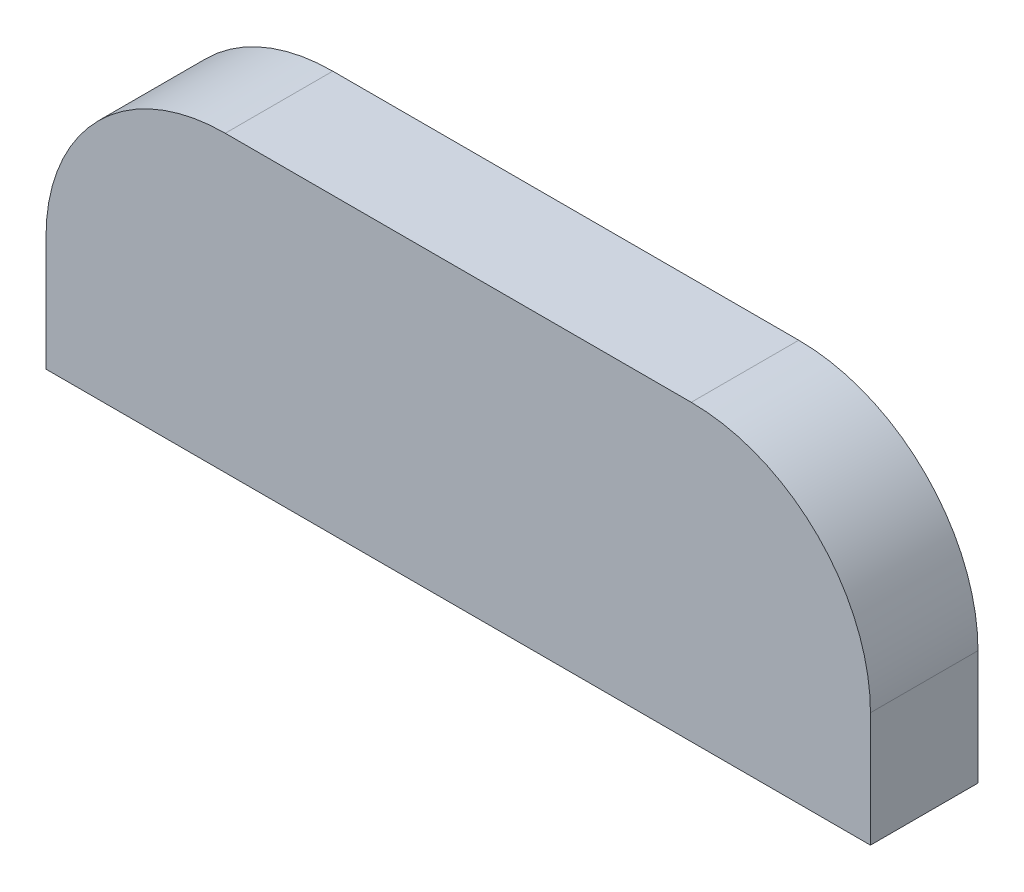
ISO-10303-21;
HEADER;
FILE_DESCRIPTION(('STEP AP214'),'2;1');
FILE_NAME('part.step','',(''),(''),'','','');
FILE_SCHEMA(('AUTOMOTIVE_DESIGN { 1 0 10303 214 1 1 1 1 }'));
ENDSEC;
DATA;
#1=APPLICATION_CONTEXT('core data for automotive mechanical design processes');
#2=APPLICATION_PROTOCOL_DEFINITION('international standard','automotive_design',2000,#1);
#3=PRODUCT_CONTEXT('',#1,'mechanical');
#4=PRODUCT('Part','Part','',(#3));
#5=PRODUCT_RELATED_PRODUCT_CATEGORY('part','',(#4));
#6=PRODUCT_DEFINITION_FORMATION('','',#4);
#7=PRODUCT_DEFINITION_CONTEXT('part definition',#1,'design');
#8=PRODUCT_DEFINITION('design','',#6,#7);
#9=PRODUCT_DEFINITION_SHAPE('','',#8);
#10=(LENGTH_UNIT() NAMED_UNIT(*) SI_UNIT(.MILLI.,.METRE.));
#11=(NAMED_UNIT(*) PLANE_ANGLE_UNIT() SI_UNIT($,.RADIAN.));
#12=(NAMED_UNIT(*) SI_UNIT($,.STERADIAN.) SOLID_ANGLE_UNIT());
#13=UNCERTAINTY_MEASURE_WITH_UNIT(LENGTH_MEASURE(1.E-05),#10,'distance_accuracy_value','');
#14=(GEOMETRIC_REPRESENTATION_CONTEXT(3) GLOBAL_UNCERTAINTY_ASSIGNED_CONTEXT((#13)) GLOBAL_UNIT_ASSIGNED_CONTEXT((#10,
#11,#12)) REPRESENTATION_CONTEXT('',''));
#15=CARTESIAN_POINT('',(0.,0.,0.));
#16=DIRECTION('',(0.,0.,1.));
#17=DIRECTION('',(1.,0.,0.));
#18=AXIS2_PLACEMENT_3D('',#15,#16,#17);
#19=CARTESIAN_POINT('',(0.,2.94,1.24));
#20=DIRECTION('',(0.,0.,1.));
#21=DIRECTION('',(1.,0.,0.));
#22=AXIS2_PLACEMENT_3D('',#19,#20,#21);
#23=PLANE('',#22);
#24=CARTESIAN_POINT('',(-0.6500000000026,2.85,1.24));
#25=DIRECTION('',(0.,0.,-1.));
#26=DIRECTION('',(-1.,0.,0.));
#27=AXIS2_PLACEMENT_3D('',#24,#25,#26);
#28=CIRCLE('',#27,0.4999999999975);
#29=CARTESIAN_POINT('',(-0.6499999999975,3.34999999999875,1.24));
#30=VERTEX_POINT('',#29);
#31=CARTESIAN_POINT('',(-1.15,2.8500000000005,1.24));
#32=VERTEX_POINT('',#31);
#33=EDGE_CURVE('E82',#30,#32,#28,.F.);
#34=ORIENTED_EDGE('',*,*,#33,.F.);
#35=DIRECTION('',(1.,0.,0.));
#36=VECTOR('',#35,1.);
#37=CARTESIAN_POINT('',(0.,3.35,1.24));
#38=LINE('',#37,#36);
#39=CARTESIAN_POINT('',(0.64999999999625,3.35,1.24));
#40=VERTEX_POINT('',#39);
#41=EDGE_CURVE('E80',#40,#30,#38,.F.);
#42=ORIENTED_EDGE('',*,*,#41,.F.);
#43=CARTESIAN_POINT('',(0.6500000000026,2.85,1.24));
#44=DIRECTION('',(0.,0.,-1.));
#45=DIRECTION('',(-1.,0.,0.));
#46=AXIS2_PLACEMENT_3D('',#43,#44,#45);
#47=CIRCLE('',#46,0.4999999999975);
#48=CARTESIAN_POINT('',(1.15000000000005,2.85,1.24));
#49=VERTEX_POINT('',#48);
#50=EDGE_CURVE('E20',#49,#40,#47,.F.);
#51=ORIENTED_EDGE('',*,*,#50,.F.);
#52=DIRECTION('',(0.,1.,0.));
#53=VECTOR('',#52,1.);
#54=CARTESIAN_POINT('',(1.15,2.69,1.24));
#55=LINE('',#54,#53);
#56=CARTESIAN_POINT('',(1.15,2.53,1.24));
#57=VERTEX_POINT('',#56);
#58=EDGE_CURVE('E66',#49,#57,#55,.F.);
#59=ORIENTED_EDGE('',*,*,#58,.T.);
#60=DIRECTION('',(1.,0.,0.));
#61=VECTOR('',#60,1.);
#62=CARTESIAN_POINT('',(0.,2.53,1.24));
#63=LINE('',#62,#61);
#64=CARTESIAN_POINT('',(-1.15,2.53,1.24));
#65=VERTEX_POINT('',#64);
#66=EDGE_CURVE('E104',#57,#65,#63,.F.);
#67=ORIENTED_EDGE('',*,*,#66,.T.);
#68=DIRECTION('',(0.,1.,0.));
#69=VECTOR('',#68,1.);
#70=CARTESIAN_POINT('',(-1.15,2.69,1.24));
#71=LINE('',#70,#69);
#72=EDGE_CURVE('E106',#32,#65,#71,.F.);
#73=ORIENTED_EDGE('',*,*,#72,.F.);
#74=EDGE_LOOP('',(#34,#42,#51,#59,#67,#73));
#75=FACE_BOUND('',#74,.T.);
#76=ADVANCED_FACE('F17',(#75),#23,.F.);
#77=CARTESIAN_POINT('',(1.15,2.69,1.39));
#78=DIRECTION('',(-1.,0.,0.));
#79=DIRECTION('',(0.,0.,1.));
#80=AXIS2_PLACEMENT_3D('',#77,#78,#79);
#81=PLANE('',#80);
#82=DIRECTION('',(0.,0.,-1.));
#83=VECTOR('',#82,1.);
#84=CARTESIAN_POINT('',(1.1500000000001,2.85,1.39));
#85=LINE('',#84,#83);
#86=CARTESIAN_POINT('',(1.15000000000005,2.85,1.54));
#87=VERTEX_POINT('',#86);
#88=EDGE_CURVE('E77',#87,#49,#85,.T.);
#89=ORIENTED_EDGE('',*,*,#88,.F.);
#90=DIRECTION('',(0.,1.,0.));
#91=VECTOR('',#90,1.);
#92=CARTESIAN_POINT('',(1.15,2.94,1.54));
#93=LINE('',#92,#91);
#94=CARTESIAN_POINT('',(1.15,2.53,1.54));
#95=VERTEX_POINT('',#94);
#96=EDGE_CURVE('E98',#95,#87,#93,.T.);
#97=ORIENTED_EDGE('',*,*,#96,.F.);
#98=DIRECTION('',(0.,0.,1.));
#99=VECTOR('',#98,1.);
#100=CARTESIAN_POINT('',(1.15,2.53,1.39));
#101=LINE('',#100,#99);
#102=EDGE_CURVE('E96',#95,#57,#101,.F.);
#103=ORIENTED_EDGE('',*,*,#102,.T.);
#104=ORIENTED_EDGE('',*,*,#58,.F.);
#105=EDGE_LOOP('',(#89,#97,#103,#104));
#106=FACE_BOUND('',#105,.T.);
#107=ADVANCED_FACE('F139',(#106),#81,.F.);
#108=CARTESIAN_POINT('',(0.6500000000026,2.85,1.39));
#109=DIRECTION('',(0.,0.,-1.));
#110=DIRECTION('',(-1.,0.,0.));
#111=AXIS2_PLACEMENT_3D('',#108,#109,#110);
#112=CYLINDRICAL_SURFACE('',#111,0.4999999999975);
#113=ORIENTED_EDGE('',*,*,#88,.T.);
#114=ORIENTED_EDGE('',*,*,#50,.T.);
#115=DIRECTION('',(0.,0.,1.));
#116=VECTOR('',#115,1.);
#117=CARTESIAN_POINT('',(0.6499999999899,3.35,1.39));
#118=LINE('',#117,#116);
#119=CARTESIAN_POINT('',(0.64999999999625,3.3499999999995,1.54));
#120=VERTEX_POINT('',#119);
#121=EDGE_CURVE('E75',#120,#40,#118,.F.);
#122=ORIENTED_EDGE('',*,*,#121,.F.);
#123=CARTESIAN_POINT('',(0.6500000000026,2.85,1.54));
#124=DIRECTION('',(0.,0.,-1.));
#125=DIRECTION('',(-1.,0.,0.));
#126=AXIS2_PLACEMENT_3D('',#123,#124,#125);
#127=CIRCLE('',#126,0.4999999999975);
#128=EDGE_CURVE('E116',#87,#120,#127,.F.);
#129=ORIENTED_EDGE('',*,*,#128,.F.);
#130=EDGE_LOOP('',(#113,#114,#122,#129));
#131=FACE_BOUND('',#130,.T.);
#132=ADVANCED_FACE('F72',(#131),#112,.T.);
#133=CARTESIAN_POINT('',(0.,3.35,1.39));
#134=DIRECTION('',(0.,1.,0.));
#135=DIRECTION('',(0.,0.,1.));
#136=AXIS2_PLACEMENT_3D('',#133,#134,#135);
#137=PLANE('',#136);
#138=ORIENTED_EDGE('',*,*,#121,.T.);
#139=ORIENTED_EDGE('',*,*,#41,.T.);
#140=DIRECTION('',(0.,0.,-1.));
#141=VECTOR('',#140,1.);
#142=CARTESIAN_POINT('',(-0.6499999999924,3.3499999999975,1.39));
#143=LINE('',#142,#141);
#144=CARTESIAN_POINT('',(-0.6499999999975,3.34999999999825,1.54));
#145=VERTEX_POINT('',#144);
#146=EDGE_CURVE('E85',#145,#30,#143,.T.);
#147=ORIENTED_EDGE('',*,*,#146,.F.);
#148=DIRECTION('',(1.,0.,0.));
#149=VECTOR('',#148,1.);
#150=CARTESIAN_POINT('',(0.,3.349999999999,1.54));
#151=LINE('',#150,#149);
#152=EDGE_CURVE('E89',#120,#145,#151,.F.);
#153=ORIENTED_EDGE('',*,*,#152,.F.);
#154=EDGE_LOOP('',(#138,#139,#147,#153));
#155=FACE_BOUND('',#154,.T.);
#156=ADVANCED_FACE('F87',(#155),#137,.T.);
#157=CARTESIAN_POINT('',(-0.6500000000026,2.85,1.39));
#158=DIRECTION('',(0.,0.,-1.));
#159=DIRECTION('',(-1.,0.,0.));
#160=AXIS2_PLACEMENT_3D('',#157,#158,#159);
#161=CYLINDRICAL_SURFACE('',#160,0.4999999999975);
#162=ORIENTED_EDGE('',*,*,#146,.T.);
#163=ORIENTED_EDGE('',*,*,#33,.T.);
#164=DIRECTION('',(0.,0.,1.));
#165=VECTOR('',#164,1.);
#166=CARTESIAN_POINT('',(-1.15,2.850000000001,1.39));
#167=LINE('',#166,#165);
#168=CARTESIAN_POINT('',(-1.15,2.8500000000005,1.54));
#169=VERTEX_POINT('',#168);
#170=EDGE_CURVE('E110',#169,#32,#167,.F.);
#171=ORIENTED_EDGE('',*,*,#170,.F.);
#172=CARTESIAN_POINT('',(-0.6500000000026,2.85,1.54));
#173=DIRECTION('',(0.,0.,-1.));
#174=DIRECTION('',(-1.,0.,0.));
#175=AXIS2_PLACEMENT_3D('',#172,#173,#174);
#176=CIRCLE('',#175,0.4999999999975);
#177=EDGE_CURVE('E113',#145,#169,#176,.F.);
#178=ORIENTED_EDGE('',*,*,#177,.F.);
#179=EDGE_LOOP('',(#162,#163,#171,#178));
#180=FACE_BOUND('',#179,.T.);
#181=ADVANCED_FACE('F121',(#180),#161,.T.);
#182=CARTESIAN_POINT('',(-1.15,2.69,1.39));
#183=DIRECTION('',(-1.,0.,0.));
#184=DIRECTION('',(0.,0.,1.));
#185=AXIS2_PLACEMENT_3D('',#182,#183,#184);
#186=PLANE('',#185);
#187=ORIENTED_EDGE('',*,*,#72,.T.);
#188=DIRECTION('',(0.,0.,1.));
#189=VECTOR('',#188,1.);
#190=CARTESIAN_POINT('',(-1.15,2.53,1.39));
#191=LINE('',#190,#189);
#192=CARTESIAN_POINT('',(-1.15,2.53,1.54));
#193=VERTEX_POINT('',#192);
#194=EDGE_CURVE('E35',#65,#193,#191,.T.);
#195=ORIENTED_EDGE('',*,*,#194,.T.);
#196=DIRECTION('',(0.,1.,0.));
#197=VECTOR('',#196,1.);
#198=CARTESIAN_POINT('',(-1.15,2.94,1.54));
#199=LINE('',#198,#197);
#200=EDGE_CURVE('E26',#169,#193,#199,.F.);
#201=ORIENTED_EDGE('',*,*,#200,.F.);
#202=ORIENTED_EDGE('',*,*,#170,.T.);
#203=EDGE_LOOP('',(#187,#195,#201,#202));
#204=FACE_BOUND('',#203,.T.);
#205=ADVANCED_FACE('F143',(#204),#186,.T.);
#206=CARTESIAN_POINT('',(0.,2.53,1.39));
#207=DIRECTION('',(0.,1.,0.));
#208=DIRECTION('',(0.,0.,1.));
#209=AXIS2_PLACEMENT_3D('',#206,#207,#208);
#210=PLANE('',#209);
#211=DIRECTION('',(1.,0.,0.));
#212=VECTOR('',#211,1.);
#213=CARTESIAN_POINT('',(0.,2.53,1.54));
#214=LINE('',#213,#212);
#215=EDGE_CURVE('E11',#193,#95,#214,.T.);
#216=ORIENTED_EDGE('',*,*,#215,.F.);
#217=ORIENTED_EDGE('',*,*,#194,.F.);
#218=ORIENTED_EDGE('',*,*,#66,.F.);
#219=ORIENTED_EDGE('',*,*,#102,.F.);
#220=EDGE_LOOP('',(#216,#217,#218,#219));
#221=FACE_BOUND('',#220,.T.);
#222=ADVANCED_FACE('F142',(#221),#210,.F.);
#223=CARTESIAN_POINT('',(0.,2.94,1.54));
#224=DIRECTION('',(0.,0.,1.));
#225=DIRECTION('',(1.,0.,0.));
#226=AXIS2_PLACEMENT_3D('',#223,#224,#225);
#227=PLANE('',#226);
#228=ORIENTED_EDGE('',*,*,#200,.T.);
#229=ORIENTED_EDGE('',*,*,#215,.T.);
#230=ORIENTED_EDGE('',*,*,#96,.T.);
#231=ORIENTED_EDGE('',*,*,#128,.T.);
#232=ORIENTED_EDGE('',*,*,#152,.T.);
#233=ORIENTED_EDGE('',*,*,#177,.T.);
#234=EDGE_LOOP('',(#228,#229,#230,#231,#232,#233));
#235=FACE_BOUND('',#234,.T.);
#236=ADVANCED_FACE('F124',(#235),#227,.T.);
#237=CLOSED_SHELL('',(#76,#107,#132,#156,#181,#205,#222,#236));
#238=MANIFOLD_SOLID_BREP('B1',#237);
#239=ADVANCED_BREP_SHAPE_REPRESENTATION('',(#18,#238),#14);
#240=SHAPE_DEFINITION_REPRESENTATION(#9,#239);
ENDSEC;
END-ISO-10303-21;
